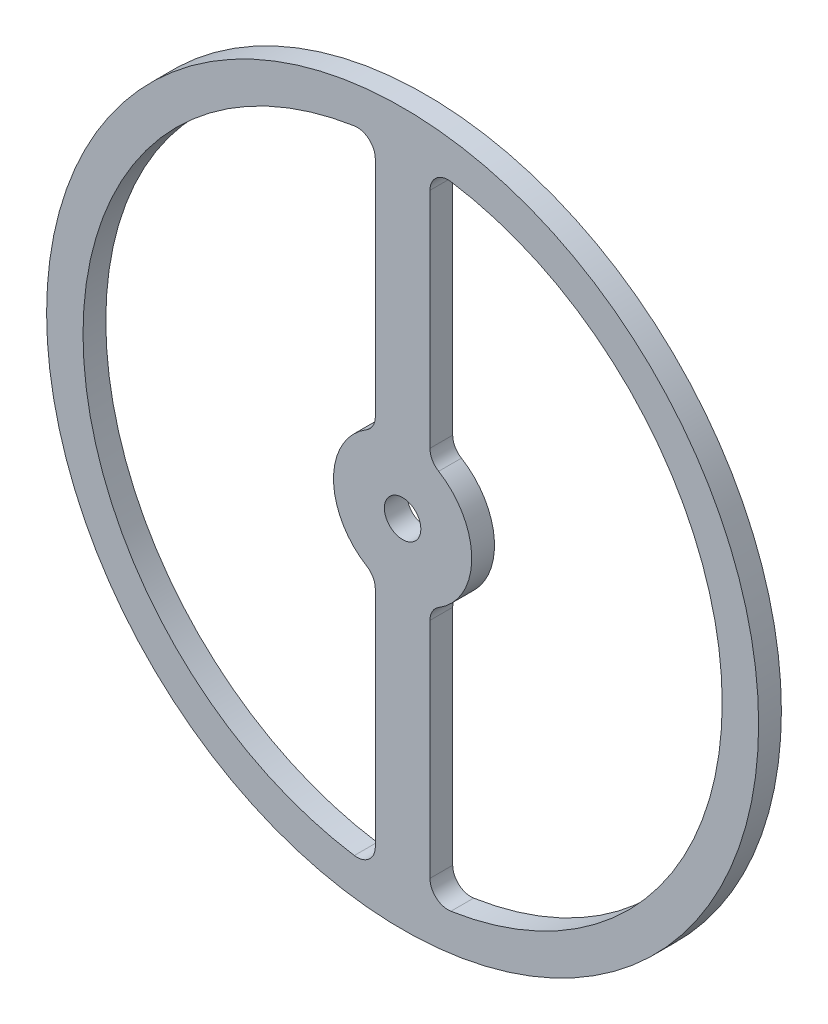
ISO-10303-21;
HEADER;
FILE_DESCRIPTION(('STEP AP214'),'2;1');
FILE_NAME('part.step','',(''),(''),'','','');
FILE_SCHEMA(('AUTOMOTIVE_DESIGN { 1 0 10303 214 1 1 1 1 }'));
ENDSEC;
DATA;
#1=APPLICATION_CONTEXT('core data for automotive mechanical design processes');
#2=APPLICATION_PROTOCOL_DEFINITION('international standard','automotive_design',2000,#1);
#3=PRODUCT_CONTEXT('',#1,'mechanical');
#4=PRODUCT('Part','Part','',(#3));
#5=PRODUCT_RELATED_PRODUCT_CATEGORY('part','',(#4));
#6=PRODUCT_DEFINITION_FORMATION('','',#4);
#7=PRODUCT_DEFINITION_CONTEXT('part definition',#1,'design');
#8=PRODUCT_DEFINITION('design','',#6,#7);
#9=PRODUCT_DEFINITION_SHAPE('','',#8);
#10=(LENGTH_UNIT() NAMED_UNIT(*) SI_UNIT(.MILLI.,.METRE.));
#11=(NAMED_UNIT(*) PLANE_ANGLE_UNIT() SI_UNIT($,.RADIAN.));
#12=(NAMED_UNIT(*) SI_UNIT($,.STERADIAN.) SOLID_ANGLE_UNIT());
#13=UNCERTAINTY_MEASURE_WITH_UNIT(LENGTH_MEASURE(1.E-05),#10,'distance_accuracy_value','');
#14=(GEOMETRIC_REPRESENTATION_CONTEXT(3) GLOBAL_UNCERTAINTY_ASSIGNED_CONTEXT((#13)) GLOBAL_UNIT_ASSIGNED_CONTEXT((#10,
#11,#12)) REPRESENTATION_CONTEXT('',''));
#15=CARTESIAN_POINT('',(0.,0.,0.));
#16=DIRECTION('',(0.,0.,1.));
#17=DIRECTION('',(1.,0.,0.));
#18=AXIS2_PLACEMENT_3D('',#15,#16,#17);
#19=CARTESIAN_POINT('',(0.,0.,3.175));
#20=DIRECTION('',(0.,0.,-1.));
#21=DIRECTION('',(-1.,0.,0.));
#22=AXIS2_PLACEMENT_3D('',#19,#20,#21);
#23=CYLINDRICAL_SURFACE('',#22,49.657);
#24=CARTESIAN_POINT('',(0.,0.,3.175));
#25=DIRECTION('',(0.,0.,1.));
#26=DIRECTION('',(1.,0.,0.));
#27=AXIS2_PLACEMENT_3D('',#24,#25,#26);
#28=CIRCLE('',#27,49.657);
#29=CARTESIAN_POINT('',(49.657,0.,3.175));
#30=VERTEX_POINT('',#29);
#31=EDGE_CURVE('E196',#30,#30,#28,.T.);
#32=ORIENTED_EDGE('',*,*,#31,.F.);
#33=EDGE_LOOP('',(#32));
#34=FACE_BOUND('',#33,.T.);
#35=CARTESIAN_POINT('',(0.,0.,0.));
#36=DIRECTION('',(0.,0.,1.));
#37=DIRECTION('',(1.,0.,0.));
#38=AXIS2_PLACEMENT_3D('',#35,#36,#37);
#39=CIRCLE('',#38,49.657);
#40=CARTESIAN_POINT('',(49.657,0.,0.));
#41=VERTEX_POINT('',#40);
#42=EDGE_CURVE('E205',#41,#41,#39,.T.);
#43=ORIENTED_EDGE('',*,*,#42,.T.);
#44=EDGE_LOOP('',(#43));
#45=FACE_BOUND('',#44,.T.);
#46=ADVANCED_FACE('F39',(#34,#45),#23,.T.);
#47=CARTESIAN_POINT('',(0.,0.,3.175));
#48=DIRECTION('',(0.,0.,1.));
#49=DIRECTION('',(1.,0.,0.));
#50=AXIS2_PLACEMENT_3D('',#47,#48,#49);
#51=PLANE('',#50);
#52=CARTESIAN_POINT('',(0.,0.,3.175));
#53=DIRECTION('',(0.,0.,1.));
#54=DIRECTION('',(1.,0.,0.));
#55=AXIS2_PLACEMENT_3D('',#52,#53,#54);
#56=CIRCLE('',#55,2.54);
#57=CARTESIAN_POINT('',(2.54,0.,3.175));
#58=VERTEX_POINT('',#57);
#59=EDGE_CURVE('E363',#58,#58,#56,.T.);
#60=ORIENTED_EDGE('',*,*,#59,.F.);
#61=EDGE_LOOP('',(#60));
#62=FACE_BOUND('',#61,.T.);
#63=CARTESIAN_POINT('',(0.,0.,3.175));
#64=DIRECTION('',(0.,0.,1.));
#65=DIRECTION('',(1.,0.,0.));
#66=AXIS2_PLACEMENT_3D('',#63,#64,#65);
#67=CIRCLE('',#66,44.577);
#68=CARTESIAN_POINT('',(-6.73368580060423,44.0654786033096,3.175));
#69=VERTEX_POINT('',#68);
#70=CARTESIAN_POINT('',(-6.73368580060391,-44.0654786033097,3.175));
#71=VERTEX_POINT('',#70);
#72=EDGE_CURVE('E177',#69,#71,#67,.T.);
#73=ORIENTED_EDGE('',*,*,#72,.F.);
#74=CARTESIAN_POINT('',(-6.35,41.5546251216396,3.175));
#75=DIRECTION('',(0.,0.,1.));
#76=DIRECTION('',(1.,0.,0.));
#77=AXIS2_PLACEMENT_3D('',#74,#75,#76);
#78=CIRCLE('',#77,2.54);
#79=CARTESIAN_POINT('',(-3.81,41.5546251216396,3.175));
#80=VERTEX_POINT('',#79);
#81=EDGE_CURVE('E229',#69,#80,#78,.F.);
#82=ORIENTED_EDGE('',*,*,#81,.T.);
#83=DIRECTION('',(0.,1.,0.));
#84=VECTOR('',#83,1.);
#85=CARTESIAN_POINT('',(-3.81,44.4138810396029,3.175));
#86=LINE('',#85,#84);
#87=CARTESIAN_POINT('',(-3.80999999999999,10.3923883625729,3.175));
#88=VERTEX_POINT('',#87);
#89=EDGE_CURVE('E355',#88,#80,#86,.T.);
#90=ORIENTED_EDGE('',*,*,#89,.F.);
#91=CARTESIAN_POINT('',(-6.35,10.3923883625729,3.175));
#92=DIRECTION('',(0.,0.,1.));
#93=DIRECTION('',(1.,0.,0.));
#94=AXIS2_PLACEMENT_3D('',#91,#92,#93);
#95=CIRCLE('',#94,2.54);
#96=CARTESIAN_POINT('',(-5.02565425026832,8.2249686212289,3.175));
#97=VERTEX_POINT('',#96);
#98=EDGE_CURVE('E259',#88,#97,#95,.F.);
#99=ORIENTED_EDGE('',*,*,#98,.T.);
#100=CARTESIAN_POINT('',(0.,0.,3.175));
#101=DIRECTION('',(0.,0.,-1.));
#102=DIRECTION('',(1.,0.,0.));
#103=AXIS2_PLACEMENT_3D('',#100,#101,#102);
#104=CIRCLE('',#103,9.63884378250006);
#105=CARTESIAN_POINT('',(-5.02565425026826,-8.22496862122893,3.175));
#106=VERTEX_POINT('',#105);
#107=EDGE_CURVE('E352',#106,#97,#104,.T.);
#108=ORIENTED_EDGE('',*,*,#107,.F.);
#109=CARTESIAN_POINT('',(-6.34999999999992,-10.3923883625729,3.175));
#110=DIRECTION('',(0.,0.,1.));
#111=DIRECTION('',(1.,0.,0.));
#112=AXIS2_PLACEMENT_3D('',#109,#110,#111);
#113=CIRCLE('',#112,2.54);
#114=CARTESIAN_POINT('',(-3.80999999999992,-10.3923883625729,3.175));
#115=VERTEX_POINT('',#114);
#116=EDGE_CURVE('E251',#106,#115,#113,.F.);
#117=ORIENTED_EDGE('',*,*,#116,.T.);
#118=DIRECTION('',(0.,1.,0.));
#119=VECTOR('',#118,1.);
#120=CARTESIAN_POINT('',(-3.80999999999994,-8.85388103960294,3.175));
#121=LINE('',#120,#119);
#122=CARTESIAN_POINT('',(-3.8099999999997,-41.5546251216396,3.175));
#123=VERTEX_POINT('',#122);
#124=EDGE_CURVE('E182',#123,#115,#121,.T.);
#125=ORIENTED_EDGE('',*,*,#124,.F.);
#126=CARTESIAN_POINT('',(-6.3499999999997,-41.5546251216396,3.175));
#127=DIRECTION('',(0.,0.,1.));
#128=DIRECTION('',(1.,0.,0.));
#129=AXIS2_PLACEMENT_3D('',#126,#127,#128);
#130=CIRCLE('',#129,2.54);
#131=EDGE_CURVE('E228',#123,#71,#130,.F.);
#132=ORIENTED_EDGE('',*,*,#131,.T.);
#133=EDGE_LOOP('',(#73,#82,#90,#99,#108,#117,#125,#132));
#134=FACE_BOUND('',#133,.T.);
#135=CARTESIAN_POINT('',(0.,0.,3.175));
#136=DIRECTION('',(0.,0.,1.));
#137=DIRECTION('',(1.,0.,0.));
#138=AXIS2_PLACEMENT_3D('',#135,#136,#137);
#139=CIRCLE('',#138,44.577);
#140=CARTESIAN_POINT('',(6.73368580060392,-44.0654786033097,3.175));
#141=VERTEX_POINT('',#140);
#142=CARTESIAN_POINT('',(6.73368580060422,44.0654786033096,3.175));
#143=VERTEX_POINT('',#142);
#144=EDGE_CURVE('E169',#141,#143,#139,.T.);
#145=ORIENTED_EDGE('',*,*,#144,.F.);
#146=CARTESIAN_POINT('',(6.34999999999971,-41.5546251216396,3.175));
#147=DIRECTION('',(0.,0.,1.));
#148=DIRECTION('',(1.,0.,0.));
#149=AXIS2_PLACEMENT_3D('',#146,#147,#148);
#150=CIRCLE('',#149,2.54);
#151=CARTESIAN_POINT('',(3.80999999999971,-41.5546251216396,3.175));
#152=VERTEX_POINT('',#151);
#153=EDGE_CURVE('E154',#141,#152,#150,.F.);
#154=ORIENTED_EDGE('',*,*,#153,.T.);
#155=DIRECTION('',(0.,-1.,0.));
#156=VECTOR('',#155,1.);
#157=CARTESIAN_POINT('',(3.80999999999969,-44.4138810396029,3.175));
#158=LINE('',#157,#156);
#159=CARTESIAN_POINT('',(3.80999999999992,-10.3923883625729,3.175));
#160=VERTEX_POINT('',#159);
#161=EDGE_CURVE('E200',#160,#152,#158,.T.);
#162=ORIENTED_EDGE('',*,*,#161,.F.);
#163=CARTESIAN_POINT('',(6.34999999999992,-10.3923883625729,3.175));
#164=DIRECTION('',(0.,0.,1.));
#165=DIRECTION('',(1.,0.,0.));
#166=AXIS2_PLACEMENT_3D('',#163,#164,#165);
#167=CIRCLE('',#166,2.54);
#168=CARTESIAN_POINT('',(5.02565425026826,-8.22496862122893,3.175));
#169=VERTEX_POINT('',#168);
#170=EDGE_CURVE('E50',#160,#169,#167,.F.);
#171=ORIENTED_EDGE('',*,*,#170,.T.);
#172=CARTESIAN_POINT('',(0.,0.,3.175));
#173=DIRECTION('',(0.,0.,-1.));
#174=DIRECTION('',(1.,0.,0.));
#175=AXIS2_PLACEMENT_3D('',#172,#173,#174);
#176=CIRCLE('',#175,9.63884378250006);
#177=CARTESIAN_POINT('',(5.02565425026832,8.2249686212289,3.175));
#178=VERTEX_POINT('',#177);
#179=EDGE_CURVE('E187',#178,#169,#176,.T.);
#180=ORIENTED_EDGE('',*,*,#179,.F.);
#181=CARTESIAN_POINT('',(6.35,10.3923883625729,3.175));
#182=DIRECTION('',(0.,0.,1.));
#183=DIRECTION('',(1.,0.,0.));
#184=AXIS2_PLACEMENT_3D('',#181,#182,#183);
#185=CIRCLE('',#184,2.54);
#186=CARTESIAN_POINT('',(3.81,10.3923883625729,3.175));
#187=VERTEX_POINT('',#186);
#188=EDGE_CURVE('E264',#178,#187,#185,.F.);
#189=ORIENTED_EDGE('',*,*,#188,.T.);
#190=DIRECTION('',(0.,-1.,0.));
#191=VECTOR('',#190,1.);
#192=CARTESIAN_POINT('',(3.81,8.85388103960292,3.175));
#193=LINE('',#192,#191);
#194=CARTESIAN_POINT('',(3.80999999999999,41.5546251216396,3.175));
#195=VERTEX_POINT('',#194);
#196=EDGE_CURVE('E179',#195,#187,#193,.T.);
#197=ORIENTED_EDGE('',*,*,#196,.F.);
#198=CARTESIAN_POINT('',(6.34999999999999,41.5546251216396,3.175));
#199=DIRECTION('',(0.,0.,1.));
#200=DIRECTION('',(1.,0.,0.));
#201=AXIS2_PLACEMENT_3D('',#198,#199,#200);
#202=CIRCLE('',#201,2.54);
#203=EDGE_CURVE('E178',#195,#143,#202,.F.);
#204=ORIENTED_EDGE('',*,*,#203,.T.);
#205=EDGE_LOOP('',(#145,#154,#162,#171,#180,#189,#197,#204));
#206=FACE_BOUND('',#205,.T.);
#207=ORIENTED_EDGE('',*,*,#31,.T.);
#208=EDGE_LOOP('',(#207));
#209=FACE_BOUND('',#208,.T.);
#210=ADVANCED_FACE('F174',(#62,#134,#206,#209),#51,.T.);
#211=CARTESIAN_POINT('',(0.,0.,0.));
#212=DIRECTION('',(0.,0.,1.));
#213=DIRECTION('',(1.,0.,0.));
#214=AXIS2_PLACEMENT_3D('',#211,#212,#213);
#215=PLANE('',#214);
#216=CARTESIAN_POINT('',(0.,0.,0.));
#217=DIRECTION('',(0.,0.,1.));
#218=DIRECTION('',(1.,0.,0.));
#219=AXIS2_PLACEMENT_3D('',#216,#217,#218);
#220=CIRCLE('',#219,2.54);
#221=CARTESIAN_POINT('',(2.54,0.,0.));
#222=VERTEX_POINT('',#221);
#223=EDGE_CURVE('E194',#222,#222,#220,.T.);
#224=ORIENTED_EDGE('',*,*,#223,.T.);
#225=EDGE_LOOP('',(#224));
#226=FACE_BOUND('',#225,.T.);
#227=CARTESIAN_POINT('',(0.,0.,0.));
#228=DIRECTION('',(0.,0.,-1.));
#229=DIRECTION('',(1.,0.,0.));
#230=AXIS2_PLACEMENT_3D('',#227,#228,#229);
#231=CIRCLE('',#230,9.63884378250006);
#232=CARTESIAN_POINT('',(-5.02565425026826,-8.22496862122893,0.));
#233=VERTEX_POINT('',#232);
#234=CARTESIAN_POINT('',(-5.02565425026832,8.2249686212289,0.));
#235=VERTEX_POINT('',#234);
#236=EDGE_CURVE('E331',#233,#235,#231,.T.);
#237=ORIENTED_EDGE('',*,*,#236,.T.);
#238=CARTESIAN_POINT('',(-6.35,10.3923883625729,0.));
#239=DIRECTION('',(0.,0.,1.));
#240=DIRECTION('',(1.,0.,0.));
#241=AXIS2_PLACEMENT_3D('',#238,#239,#240);
#242=CIRCLE('',#241,2.54);
#243=CARTESIAN_POINT('',(-3.80999999999999,10.3923883625729,0.));
#244=VERTEX_POINT('',#243);
#245=EDGE_CURVE('E258',#235,#244,#242,.T.);
#246=ORIENTED_EDGE('',*,*,#245,.T.);
#247=DIRECTION('',(0.,1.,0.));
#248=VECTOR('',#247,1.);
#249=CARTESIAN_POINT('',(-3.81,44.4138810396029,0.));
#250=LINE('',#249,#248);
#251=CARTESIAN_POINT('',(-3.81,41.5546251216396,0.));
#252=VERTEX_POINT('',#251);
#253=EDGE_CURVE('E207',#244,#252,#250,.T.);
#254=ORIENTED_EDGE('',*,*,#253,.T.);
#255=CARTESIAN_POINT('',(-6.35,41.5546251216396,0.));
#256=DIRECTION('',(0.,0.,1.));
#257=DIRECTION('',(1.,0.,0.));
#258=AXIS2_PLACEMENT_3D('',#255,#256,#257);
#259=CIRCLE('',#258,2.54);
#260=CARTESIAN_POINT('',(-6.73368580060423,44.0654786033096,0.));
#261=VERTEX_POINT('',#260);
#262=EDGE_CURVE('E231',#252,#261,#259,.T.);
#263=ORIENTED_EDGE('',*,*,#262,.T.);
#264=CARTESIAN_POINT('',(0.,0.,0.));
#265=DIRECTION('',(0.,0.,1.));
#266=DIRECTION('',(1.,0.,0.));
#267=AXIS2_PLACEMENT_3D('',#264,#265,#266);
#268=CIRCLE('',#267,44.577);
#269=CARTESIAN_POINT('',(-6.73368580060391,-44.0654786033097,0.));
#270=VERTEX_POINT('',#269);
#271=EDGE_CURVE('E343',#261,#270,#268,.T.);
#272=ORIENTED_EDGE('',*,*,#271,.T.);
#273=CARTESIAN_POINT('',(-6.3499999999997,-41.5546251216396,0.));
#274=DIRECTION('',(0.,0.,1.));
#275=DIRECTION('',(1.,0.,0.));
#276=AXIS2_PLACEMENT_3D('',#273,#274,#275);
#277=CIRCLE('',#276,2.54);
#278=CARTESIAN_POINT('',(-3.8099999999997,-41.5546251216396,0.));
#279=VERTEX_POINT('',#278);
#280=EDGE_CURVE('E226',#270,#279,#277,.T.);
#281=ORIENTED_EDGE('',*,*,#280,.T.);
#282=DIRECTION('',(0.,1.,0.));
#283=VECTOR('',#282,1.);
#284=CARTESIAN_POINT('',(-3.80999999999994,-8.85388103960294,0.));
#285=LINE('',#284,#283);
#286=CARTESIAN_POINT('',(-3.80999999999992,-10.3923883625729,0.));
#287=VERTEX_POINT('',#286);
#288=EDGE_CURVE('E340',#279,#287,#285,.T.);
#289=ORIENTED_EDGE('',*,*,#288,.T.);
#290=CARTESIAN_POINT('',(-6.34999999999992,-10.3923883625729,0.));
#291=DIRECTION('',(0.,0.,1.));
#292=DIRECTION('',(1.,0.,0.));
#293=AXIS2_PLACEMENT_3D('',#290,#291,#292);
#294=CIRCLE('',#293,2.54);
#295=EDGE_CURVE('E257',#287,#233,#294,.T.);
#296=ORIENTED_EDGE('',*,*,#295,.T.);
#297=EDGE_LOOP('',(#237,#246,#254,#263,#272,#281,#289,#296));
#298=FACE_BOUND('',#297,.T.);
#299=CARTESIAN_POINT('',(0.,0.,0.));
#300=DIRECTION('',(0.,0.,-1.));
#301=DIRECTION('',(1.,0.,0.));
#302=AXIS2_PLACEMENT_3D('',#299,#300,#301);
#303=CIRCLE('',#302,9.63884378250006);
#304=CARTESIAN_POINT('',(5.02565425026832,8.2249686212289,0.));
#305=VERTEX_POINT('',#304);
#306=CARTESIAN_POINT('',(5.02565425026826,-8.22496862122893,0.));
#307=VERTEX_POINT('',#306);
#308=EDGE_CURVE('E195',#305,#307,#303,.T.);
#309=ORIENTED_EDGE('',*,*,#308,.T.);
#310=CARTESIAN_POINT('',(6.34999999999992,-10.3923883625729,0.));
#311=DIRECTION('',(0.,0.,1.));
#312=DIRECTION('',(1.,0.,0.));
#313=AXIS2_PLACEMENT_3D('',#310,#311,#312);
#314=CIRCLE('',#313,2.54);
#315=CARTESIAN_POINT('',(3.80999999999992,-10.3923883625729,0.));
#316=VERTEX_POINT('',#315);
#317=EDGE_CURVE('E11',#307,#316,#314,.T.);
#318=ORIENTED_EDGE('',*,*,#317,.T.);
#319=DIRECTION('',(0.,-1.,0.));
#320=VECTOR('',#319,1.);
#321=CARTESIAN_POINT('',(3.80999999999969,-44.4138810396029,0.));
#322=LINE('',#321,#320);
#323=CARTESIAN_POINT('',(3.80999999999971,-41.5546251216396,0.));
#324=VERTEX_POINT('',#323);
#325=EDGE_CURVE('E188',#316,#324,#322,.T.);
#326=ORIENTED_EDGE('',*,*,#325,.T.);
#327=CARTESIAN_POINT('',(6.34999999999971,-41.5546251216396,0.));
#328=DIRECTION('',(0.,0.,1.));
#329=DIRECTION('',(1.,0.,0.));
#330=AXIS2_PLACEMENT_3D('',#327,#328,#329);
#331=CIRCLE('',#330,2.54);
#332=CARTESIAN_POINT('',(6.73368580060392,-44.0654786033097,0.));
#333=VERTEX_POINT('',#332);
#334=EDGE_CURVE('E162',#324,#333,#331,.T.);
#335=ORIENTED_EDGE('',*,*,#334,.T.);
#336=CARTESIAN_POINT('',(0.,0.,0.));
#337=DIRECTION('',(0.,0.,1.));
#338=DIRECTION('',(1.,0.,0.));
#339=AXIS2_PLACEMENT_3D('',#336,#337,#338);
#340=CIRCLE('',#339,44.577);
#341=CARTESIAN_POINT('',(6.73368580060422,44.0654786033096,0.));
#342=VERTEX_POINT('',#341);
#343=EDGE_CURVE('E175',#333,#342,#340,.T.);
#344=ORIENTED_EDGE('',*,*,#343,.T.);
#345=CARTESIAN_POINT('',(6.34999999999999,41.5546251216396,0.));
#346=DIRECTION('',(0.,0.,1.));
#347=DIRECTION('',(1.,0.,0.));
#348=AXIS2_PLACEMENT_3D('',#345,#346,#347);
#349=CIRCLE('',#348,2.54);
#350=CARTESIAN_POINT('',(3.80999999999999,41.5546251216396,0.));
#351=VERTEX_POINT('',#350);
#352=EDGE_CURVE('E221',#342,#351,#349,.T.);
#353=ORIENTED_EDGE('',*,*,#352,.T.);
#354=DIRECTION('',(0.,-1.,0.));
#355=VECTOR('',#354,1.);
#356=CARTESIAN_POINT('',(3.81,8.85388103960292,0.));
#357=LINE('',#356,#355);
#358=CARTESIAN_POINT('',(3.81,10.3923883625729,0.));
#359=VERTEX_POINT('',#358);
#360=EDGE_CURVE('E193',#351,#359,#357,.T.);
#361=ORIENTED_EDGE('',*,*,#360,.T.);
#362=CARTESIAN_POINT('',(6.35,10.3923883625729,0.));
#363=DIRECTION('',(0.,0.,1.));
#364=DIRECTION('',(1.,0.,0.));
#365=AXIS2_PLACEMENT_3D('',#362,#363,#364);
#366=CIRCLE('',#365,2.54);
#367=EDGE_CURVE('E265',#359,#305,#366,.T.);
#368=ORIENTED_EDGE('',*,*,#367,.T.);
#369=EDGE_LOOP('',(#309,#318,#326,#335,#344,#353,#361,#368));
#370=FACE_BOUND('',#369,.T.);
#371=ORIENTED_EDGE('',*,*,#42,.F.);
#372=EDGE_LOOP('',(#371));
#373=FACE_BOUND('',#372,.T.);
#374=ADVANCED_FACE('F271',(#226,#298,#370,#373),#215,.F.);
#375=CARTESIAN_POINT('',(0.,0.,0.));
#376=DIRECTION('',(0.,0.,1.));
#377=DIRECTION('',(1.,0.,0.));
#378=AXIS2_PLACEMENT_3D('',#375,#376,#377);
#379=CYLINDRICAL_SURFACE('',#378,44.577);
#380=ORIENTED_EDGE('',*,*,#343,.F.);
#381=DIRECTION('',(0.,0.,1.));
#382=VECTOR('',#381,1.);
#383=CARTESIAN_POINT('',(6.73368580060392,-44.0654786033097,0.));
#384=LINE('',#383,#382);
#385=EDGE_CURVE('E157',#333,#141,#384,.T.);
#386=ORIENTED_EDGE('',*,*,#385,.T.);
#387=ORIENTED_EDGE('',*,*,#144,.T.);
#388=DIRECTION('',(0.,0.,1.));
#389=VECTOR('',#388,1.);
#390=CARTESIAN_POINT('',(6.73368580060422,44.0654786033096,0.));
#391=LINE('',#390,#389);
#392=EDGE_CURVE('E173',#143,#342,#391,.F.);
#393=ORIENTED_EDGE('',*,*,#392,.T.);
#394=EDGE_LOOP('',(#380,#386,#387,#393));
#395=FACE_BOUND('',#394,.T.);
#396=ADVANCED_FACE('F166',(#395),#379,.F.);
#397=CARTESIAN_POINT('',(3.80999999999969,-44.4138810396029,0.));
#398=DIRECTION('',(-1.,0.,0.));
#399=DIRECTION('',(0.,-1.,0.));
#400=AXIS2_PLACEMENT_3D('',#397,#398,#399);
#401=PLANE('',#400);
#402=ORIENTED_EDGE('',*,*,#325,.F.);
#403=DIRECTION('',(0.,0.,-1.));
#404=VECTOR('',#403,1.);
#405=CARTESIAN_POINT('',(3.80999999999992,-10.3923883625729,3.175));
#406=LINE('',#405,#404);
#407=EDGE_CURVE('E255',#316,#160,#406,.F.);
#408=ORIENTED_EDGE('',*,*,#407,.T.);
#409=ORIENTED_EDGE('',*,*,#161,.T.);
#410=DIRECTION('',(0.,0.,-1.));
#411=VECTOR('',#410,1.);
#412=CARTESIAN_POINT('',(3.80999999999971,-41.5546251216396,0.));
#413=LINE('',#412,#411);
#414=EDGE_CURVE('E160',#152,#324,#413,.T.);
#415=ORIENTED_EDGE('',*,*,#414,.T.);
#416=EDGE_LOOP('',(#402,#408,#409,#415));
#417=FACE_BOUND('',#416,.T.);
#418=ADVANCED_FACE('F275',(#417),#401,.F.);
#419=CARTESIAN_POINT('',(0.,0.,0.));
#420=DIRECTION('',(0.,0.,1.));
#421=DIRECTION('',(1.,0.,0.));
#422=AXIS2_PLACEMENT_3D('',#419,#420,#421);
#423=CYLINDRICAL_SURFACE('',#422,9.63884378250006);
#424=ORIENTED_EDGE('',*,*,#308,.F.);
#425=DIRECTION('',(0.,0.,1.));
#426=VECTOR('',#425,1.);
#427=CARTESIAN_POINT('',(5.02565425026832,8.2249686212289,0.));
#428=LINE('',#427,#426);
#429=EDGE_CURVE('E250',#305,#178,#428,.T.);
#430=ORIENTED_EDGE('',*,*,#429,.T.);
#431=ORIENTED_EDGE('',*,*,#179,.T.);
#432=DIRECTION('',(0.,0.,1.));
#433=VECTOR('',#432,1.);
#434=CARTESIAN_POINT('',(5.02565425026826,-8.22496862122894,0.));
#435=LINE('',#434,#433);
#436=EDGE_CURVE('E244',#169,#307,#435,.F.);
#437=ORIENTED_EDGE('',*,*,#436,.T.);
#438=EDGE_LOOP('',(#424,#430,#431,#437));
#439=FACE_BOUND('',#438,.T.);
#440=ADVANCED_FACE('F266',(#439),#423,.T.);
#441=CARTESIAN_POINT('',(3.81,8.85388103960292,0.));
#442=DIRECTION('',(-1.,0.,0.));
#443=DIRECTION('',(0.,-1.,0.));
#444=AXIS2_PLACEMENT_3D('',#441,#442,#443);
#445=PLANE('',#444);
#446=ORIENTED_EDGE('',*,*,#196,.T.);
#447=DIRECTION('',(0.,0.,-1.));
#448=VECTOR('',#447,1.);
#449=CARTESIAN_POINT('',(3.81,10.3923883625729,0.));
#450=LINE('',#449,#448);
#451=EDGE_CURVE('E249',#187,#359,#450,.T.);
#452=ORIENTED_EDGE('',*,*,#451,.T.);
#453=ORIENTED_EDGE('',*,*,#360,.F.);
#454=DIRECTION('',(0.,0.,-1.));
#455=VECTOR('',#454,1.);
#456=CARTESIAN_POINT('',(3.80999999999999,41.5546251216396,3.175));
#457=LINE('',#456,#455);
#458=EDGE_CURVE('E209',#351,#195,#457,.F.);
#459=ORIENTED_EDGE('',*,*,#458,.T.);
#460=EDGE_LOOP('',(#446,#452,#453,#459));
#461=FACE_BOUND('',#460,.T.);
#462=ADVANCED_FACE('F283',(#461),#445,.F.);
#463=CARTESIAN_POINT('',(0.,0.,0.));
#464=DIRECTION('',(0.,0.,1.));
#465=DIRECTION('',(1.,0.,0.));
#466=AXIS2_PLACEMENT_3D('',#463,#464,#465);
#467=CYLINDRICAL_SURFACE('',#466,44.577);
#468=ORIENTED_EDGE('',*,*,#72,.T.);
#469=DIRECTION('',(0.,0.,1.));
#470=VECTOR('',#469,1.);
#471=CARTESIAN_POINT('',(-6.73368580060391,-44.0654786033097,0.));
#472=LINE('',#471,#470);
#473=EDGE_CURVE('E217',#71,#270,#472,.F.);
#474=ORIENTED_EDGE('',*,*,#473,.T.);
#475=ORIENTED_EDGE('',*,*,#271,.F.);
#476=DIRECTION('',(0.,0.,1.));
#477=VECTOR('',#476,1.);
#478=CARTESIAN_POINT('',(-6.73368580060423,44.0654786033096,0.));
#479=LINE('',#478,#477);
#480=EDGE_CURVE('E213',#261,#69,#479,.T.);
#481=ORIENTED_EDGE('',*,*,#480,.T.);
#482=EDGE_LOOP('',(#468,#474,#475,#481));
#483=FACE_BOUND('',#482,.T.);
#484=ADVANCED_FACE('F377',(#483),#467,.F.);
#485=CARTESIAN_POINT('',(-3.81,44.4138810396029,0.));
#486=DIRECTION('',(1.,0.,0.));
#487=DIRECTION('',(0.,1.,0.));
#488=AXIS2_PLACEMENT_3D('',#485,#486,#487);
#489=PLANE('',#488);
#490=ORIENTED_EDGE('',*,*,#253,.F.);
#491=DIRECTION('',(0.,0.,-1.));
#492=VECTOR('',#491,1.);
#493=CARTESIAN_POINT('',(-3.80999999999999,10.3923883625729,3.175));
#494=LINE('',#493,#492);
#495=EDGE_CURVE('E245',#244,#88,#494,.F.);
#496=ORIENTED_EDGE('',*,*,#495,.T.);
#497=ORIENTED_EDGE('',*,*,#89,.T.);
#498=DIRECTION('',(0.,0.,-1.));
#499=VECTOR('',#498,1.);
#500=CARTESIAN_POINT('',(-3.81,41.5546251216396,0.));
#501=LINE('',#500,#499);
#502=EDGE_CURVE('E161',#80,#252,#501,.T.);
#503=ORIENTED_EDGE('',*,*,#502,.T.);
#504=EDGE_LOOP('',(#490,#496,#497,#503));
#505=FACE_BOUND('',#504,.T.);
#506=ADVANCED_FACE('F381',(#505),#489,.F.);
#507=CARTESIAN_POINT('',(0.,0.,0.));
#508=DIRECTION('',(0.,0.,1.));
#509=DIRECTION('',(1.,0.,0.));
#510=AXIS2_PLACEMENT_3D('',#507,#508,#509);
#511=CYLINDRICAL_SURFACE('',#510,9.63884378250006);
#512=ORIENTED_EDGE('',*,*,#236,.F.);
#513=DIRECTION('',(0.,0.,1.));
#514=VECTOR('',#513,1.);
#515=CARTESIAN_POINT('',(-5.02565425026826,-8.22496862122893,0.));
#516=LINE('',#515,#514);
#517=EDGE_CURVE('E240',#233,#106,#516,.T.);
#518=ORIENTED_EDGE('',*,*,#517,.T.);
#519=ORIENTED_EDGE('',*,*,#107,.T.);
#520=DIRECTION('',(0.,0.,1.));
#521=VECTOR('',#520,1.);
#522=CARTESIAN_POINT('',(-5.02565425026832,8.2249686212289,0.));
#523=LINE('',#522,#521);
#524=EDGE_CURVE('E232',#97,#235,#523,.F.);
#525=ORIENTED_EDGE('',*,*,#524,.T.);
#526=EDGE_LOOP('',(#512,#518,#519,#525));
#527=FACE_BOUND('',#526,.T.);
#528=ADVANCED_FACE('F339',(#527),#511,.T.);
#529=CARTESIAN_POINT('',(-3.80999999999994,-8.85388103960294,0.));
#530=DIRECTION('',(1.,0.,0.));
#531=DIRECTION('',(0.,1.,0.));
#532=AXIS2_PLACEMENT_3D('',#529,#530,#531);
#533=PLANE('',#532);
#534=ORIENTED_EDGE('',*,*,#124,.T.);
#535=DIRECTION('',(0.,0.,-1.));
#536=VECTOR('',#535,1.);
#537=CARTESIAN_POINT('',(-3.80999999999992,-10.3923883625729,0.));
#538=LINE('',#537,#536);
#539=EDGE_CURVE('E239',#115,#287,#538,.T.);
#540=ORIENTED_EDGE('',*,*,#539,.T.);
#541=ORIENTED_EDGE('',*,*,#288,.F.);
#542=DIRECTION('',(0.,0.,-1.));
#543=VECTOR('',#542,1.);
#544=CARTESIAN_POINT('',(-3.8099999999997,-41.5546251216396,3.175));
#545=LINE('',#544,#543);
#546=EDGE_CURVE('E215',#279,#123,#545,.F.);
#547=ORIENTED_EDGE('',*,*,#546,.T.);
#548=EDGE_LOOP('',(#534,#540,#541,#547));
#549=FACE_BOUND('',#548,.T.);
#550=ADVANCED_FACE('F311',(#549),#533,.F.);
#551=CARTESIAN_POINT('',(6.34999999999971,-41.5546251216396,0.));
#552=DIRECTION('',(0.,0.,1.));
#553=DIRECTION('',(1.,0.,0.));
#554=AXIS2_PLACEMENT_3D('',#551,#552,#553);
#555=CYLINDRICAL_SURFACE('',#554,2.54);
#556=ORIENTED_EDGE('',*,*,#334,.F.);
#557=ORIENTED_EDGE('',*,*,#414,.F.);
#558=ORIENTED_EDGE('',*,*,#153,.F.);
#559=ORIENTED_EDGE('',*,*,#385,.F.);
#560=EDGE_LOOP('',(#556,#557,#558,#559));
#561=FACE_BOUND('',#560,.T.);
#562=ADVANCED_FACE('F151',(#561),#555,.F.);
#563=CARTESIAN_POINT('',(6.34999999999999,41.5546251216396,0.));
#564=DIRECTION('',(0.,0.,1.));
#565=DIRECTION('',(1.,0.,0.));
#566=AXIS2_PLACEMENT_3D('',#563,#564,#565);
#567=CYLINDRICAL_SURFACE('',#566,2.54);
#568=ORIENTED_EDGE('',*,*,#352,.F.);
#569=ORIENTED_EDGE('',*,*,#392,.F.);
#570=ORIENTED_EDGE('',*,*,#203,.F.);
#571=ORIENTED_EDGE('',*,*,#458,.F.);
#572=EDGE_LOOP('',(#568,#569,#570,#571));
#573=FACE_BOUND('',#572,.T.);
#574=ADVANCED_FACE('F276',(#573),#567,.F.);
#575=CARTESIAN_POINT('',(-6.3499999999997,-41.5546251216396,0.));
#576=DIRECTION('',(0.,0.,1.));
#577=DIRECTION('',(1.,0.,0.));
#578=AXIS2_PLACEMENT_3D('',#575,#576,#577);
#579=CYLINDRICAL_SURFACE('',#578,2.54);
#580=ORIENTED_EDGE('',*,*,#280,.F.);
#581=ORIENTED_EDGE('',*,*,#473,.F.);
#582=ORIENTED_EDGE('',*,*,#131,.F.);
#583=ORIENTED_EDGE('',*,*,#546,.F.);
#584=EDGE_LOOP('',(#580,#581,#582,#583));
#585=FACE_BOUND('',#584,.T.);
#586=ADVANCED_FACE('F313',(#585),#579,.F.);
#587=CARTESIAN_POINT('',(-6.35,41.5546251216396,0.));
#588=DIRECTION('',(0.,0.,1.));
#589=DIRECTION('',(1.,0.,0.));
#590=AXIS2_PLACEMENT_3D('',#587,#588,#589);
#591=CYLINDRICAL_SURFACE('',#590,2.54);
#592=ORIENTED_EDGE('',*,*,#262,.F.);
#593=ORIENTED_EDGE('',*,*,#502,.F.);
#594=ORIENTED_EDGE('',*,*,#81,.F.);
#595=ORIENTED_EDGE('',*,*,#480,.F.);
#596=EDGE_LOOP('',(#592,#593,#594,#595));
#597=FACE_BOUND('',#596,.T.);
#598=ADVANCED_FACE('F320',(#597),#591,.F.);
#599=CARTESIAN_POINT('',(-6.34999999999992,-10.3923883625729,0.));
#600=DIRECTION('',(0.,0.,1.));
#601=DIRECTION('',(1.,0.,0.));
#602=AXIS2_PLACEMENT_3D('',#599,#600,#601);
#603=CYLINDRICAL_SURFACE('',#602,2.54);
#604=ORIENTED_EDGE('',*,*,#295,.F.);
#605=ORIENTED_EDGE('',*,*,#539,.F.);
#606=ORIENTED_EDGE('',*,*,#116,.F.);
#607=ORIENTED_EDGE('',*,*,#517,.F.);
#608=EDGE_LOOP('',(#604,#605,#606,#607));
#609=FACE_BOUND('',#608,.T.);
#610=ADVANCED_FACE('F291',(#609),#603,.F.);
#611=CARTESIAN_POINT('',(-6.35,10.3923883625729,0.));
#612=DIRECTION('',(0.,0.,1.));
#613=DIRECTION('',(1.,0.,0.));
#614=AXIS2_PLACEMENT_3D('',#611,#612,#613);
#615=CYLINDRICAL_SURFACE('',#614,2.54);
#616=ORIENTED_EDGE('',*,*,#245,.F.);
#617=ORIENTED_EDGE('',*,*,#524,.F.);
#618=ORIENTED_EDGE('',*,*,#98,.F.);
#619=ORIENTED_EDGE('',*,*,#495,.F.);
#620=EDGE_LOOP('',(#616,#617,#618,#619));
#621=FACE_BOUND('',#620,.T.);
#622=ADVANCED_FACE('F289',(#621),#615,.F.);
#623=CARTESIAN_POINT('',(6.35,10.3923883625729,0.));
#624=DIRECTION('',(0.,0.,1.));
#625=DIRECTION('',(1.,0.,0.));
#626=AXIS2_PLACEMENT_3D('',#623,#624,#625);
#627=CYLINDRICAL_SURFACE('',#626,2.54);
#628=ORIENTED_EDGE('',*,*,#367,.F.);
#629=ORIENTED_EDGE('',*,*,#451,.F.);
#630=ORIENTED_EDGE('',*,*,#188,.F.);
#631=ORIENTED_EDGE('',*,*,#429,.F.);
#632=EDGE_LOOP('',(#628,#629,#630,#631));
#633=FACE_BOUND('',#632,.T.);
#634=ADVANCED_FACE('F281',(#633),#627,.F.);
#635=CARTESIAN_POINT('',(6.34999999999992,-10.3923883625729,0.));
#636=DIRECTION('',(0.,0.,1.));
#637=DIRECTION('',(1.,0.,0.));
#638=AXIS2_PLACEMENT_3D('',#635,#636,#637);
#639=CYLINDRICAL_SURFACE('',#638,2.54);
#640=ORIENTED_EDGE('',*,*,#317,.F.);
#641=ORIENTED_EDGE('',*,*,#436,.F.);
#642=ORIENTED_EDGE('',*,*,#170,.F.);
#643=ORIENTED_EDGE('',*,*,#407,.F.);
#644=EDGE_LOOP('',(#640,#641,#642,#643));
#645=FACE_BOUND('',#644,.T.);
#646=ADVANCED_FACE('F41',(#645),#639,.F.);
#647=CARTESIAN_POINT('',(0.,0.,0.));
#648=DIRECTION('',(0.,0.,1.));
#649=DIRECTION('',(1.,0.,0.));
#650=AXIS2_PLACEMENT_3D('',#647,#648,#649);
#651=CYLINDRICAL_SURFACE('',#650,2.54);
#652=ORIENTED_EDGE('',*,*,#223,.F.);
#653=EDGE_LOOP('',(#652));
#654=FACE_BOUND('',#653,.T.);
#655=ORIENTED_EDGE('',*,*,#59,.T.);
#656=EDGE_LOOP('',(#655));
#657=FACE_BOUND('',#656,.T.);
#658=ADVANCED_FACE('F292',(#654,#657),#651,.F.);
#659=CLOSED_SHELL('',(#46,#210,#374,#396,#418,#440,#462,#484,#506,#528,#550,#562,#574,#586,#598,
#610,#622,#634,#646,#658));
#660=MANIFOLD_SOLID_BREP('B2',#659);
#661=ADVANCED_BREP_SHAPE_REPRESENTATION('',(#18,#660),#14);
#662=SHAPE_DEFINITION_REPRESENTATION(#9,#661);
ENDSEC;
END-ISO-10303-21;
